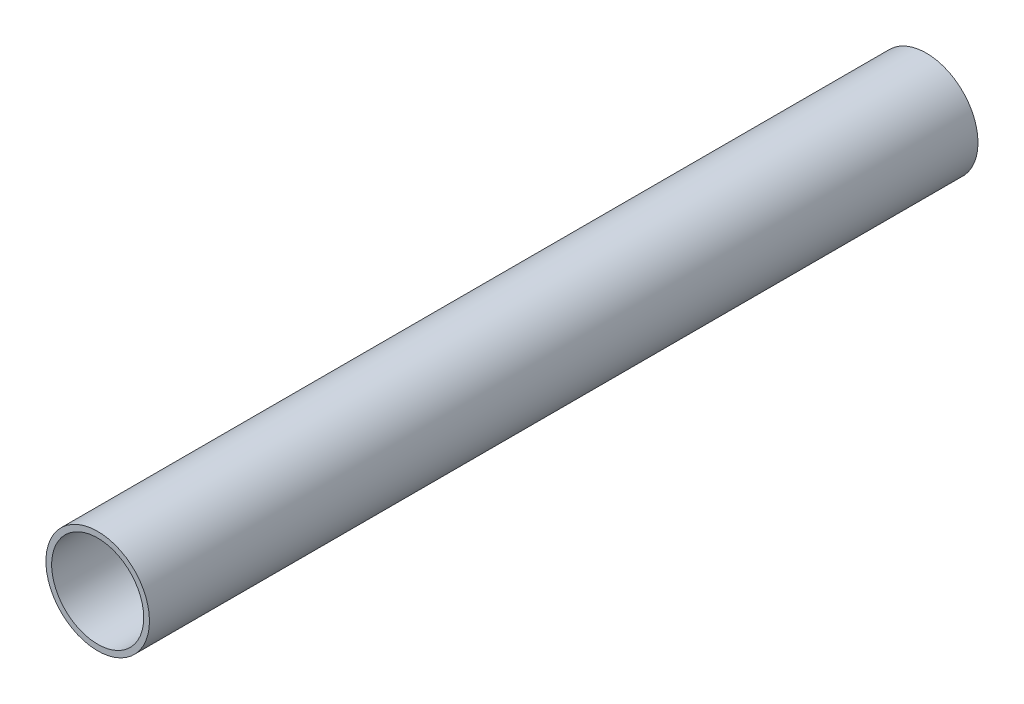
ISO-10303-21;
HEADER;
FILE_DESCRIPTION(('STEP AP214'),'2;1');
FILE_NAME('part.step','',(''),(''),'','','');
FILE_SCHEMA(('AUTOMOTIVE_DESIGN { 1 0 10303 214 1 1 1 1 }'));
ENDSEC;
DATA;
#1=APPLICATION_CONTEXT('core data for automotive mechanical design processes');
#2=APPLICATION_PROTOCOL_DEFINITION('international standard','automotive_design',2000,#1);
#3=PRODUCT_CONTEXT('',#1,'mechanical');
#4=PRODUCT('Part','Part','',(#3));
#5=PRODUCT_RELATED_PRODUCT_CATEGORY('part','',(#4));
#6=PRODUCT_DEFINITION_FORMATION('','',#4);
#7=PRODUCT_DEFINITION_CONTEXT('part definition',#1,'design');
#8=PRODUCT_DEFINITION('design','',#6,#7);
#9=PRODUCT_DEFINITION_SHAPE('','',#8);
#10=(LENGTH_UNIT() NAMED_UNIT(*) SI_UNIT(.MILLI.,.METRE.));
#11=(NAMED_UNIT(*) PLANE_ANGLE_UNIT() SI_UNIT($,.RADIAN.));
#12=(NAMED_UNIT(*) SI_UNIT($,.STERADIAN.) SOLID_ANGLE_UNIT());
#13=UNCERTAINTY_MEASURE_WITH_UNIT(LENGTH_MEASURE(1.E-05),#10,'distance_accuracy_value','');
#14=(GEOMETRIC_REPRESENTATION_CONTEXT(3) GLOBAL_UNCERTAINTY_ASSIGNED_CONTEXT((#13)) GLOBAL_UNIT_ASSIGNED_CONTEXT((#10,
#11,#12)) REPRESENTATION_CONTEXT('',''));
#15=CARTESIAN_POINT('',(0.,0.,0.));
#16=DIRECTION('',(0.,0.,1.));
#17=DIRECTION('',(1.,0.,0.));
#18=AXIS2_PLACEMENT_3D('',#15,#16,#17);
#19=CARTESIAN_POINT('',(0.,0.,228.6));
#20=DIRECTION('',(0.,0.,1.));
#21=DIRECTION('',(1.,0.,0.));
#22=AXIS2_PLACEMENT_3D('',#19,#20,#21);
#23=PLANE('',#22);
#24=CARTESIAN_POINT('',(0.,0.,228.6));
#25=DIRECTION('',(0.,0.,1.));
#26=DIRECTION('',(1.,0.,0.));
#27=AXIS2_PLACEMENT_3D('',#24,#25,#26);
#28=CIRCLE('',#27,14.2875);
#29=CARTESIAN_POINT('',(14.2875,0.,228.6));
#30=VERTEX_POINT('',#29);
#31=EDGE_CURVE('E10',#30,#30,#28,.T.);
#32=ORIENTED_EDGE('',*,*,#31,.T.);
#33=EDGE_LOOP('',(#32));
#34=FACE_BOUND('',#33,.T.);
#35=CARTESIAN_POINT('',(0.,0.,228.6));
#36=DIRECTION('',(0.,0.,1.));
#37=DIRECTION('',(1.,0.,0.));
#38=AXIS2_PLACEMENT_3D('',#35,#36,#37);
#39=CIRCLE('',#38,12.7);
#40=CARTESIAN_POINT('',(12.7,0.,228.6));
#41=VERTEX_POINT('',#40);
#42=EDGE_CURVE('E45',#41,#41,#39,.T.);
#43=ORIENTED_EDGE('',*,*,#42,.F.);
#44=EDGE_LOOP('',(#43));
#45=FACE_BOUND('',#44,.T.);
#46=ADVANCED_FACE('F34',(#34,#45),#23,.T.);
#47=CARTESIAN_POINT('',(0.,0.,0.));
#48=DIRECTION('',(0.,0.,1.));
#49=DIRECTION('',(1.,0.,0.));
#50=AXIS2_PLACEMENT_3D('',#47,#48,#49);
#51=PLANE('',#50);
#52=CARTESIAN_POINT('',(0.,0.,0.));
#53=DIRECTION('',(0.,0.,1.));
#54=DIRECTION('',(1.,0.,0.));
#55=AXIS2_PLACEMENT_3D('',#52,#53,#54);
#56=CIRCLE('',#55,14.2875);
#57=CARTESIAN_POINT('',(14.2875,0.,0.));
#58=VERTEX_POINT('',#57);
#59=EDGE_CURVE('E38',#58,#58,#56,.T.);
#60=ORIENTED_EDGE('',*,*,#59,.F.);
#61=EDGE_LOOP('',(#60));
#62=FACE_BOUND('',#61,.T.);
#63=CARTESIAN_POINT('',(0.,0.,0.));
#64=DIRECTION('',(0.,0.,1.));
#65=DIRECTION('',(1.,0.,0.));
#66=AXIS2_PLACEMENT_3D('',#63,#64,#65);
#67=CIRCLE('',#66,12.7);
#68=CARTESIAN_POINT('',(12.7,0.,0.));
#69=VERTEX_POINT('',#68);
#70=EDGE_CURVE('E47',#69,#69,#67,.T.);
#71=ORIENTED_EDGE('',*,*,#70,.T.);
#72=EDGE_LOOP('',(#71));
#73=FACE_BOUND('',#72,.T.);
#74=ADVANCED_FACE('F57',(#62,#73),#51,.F.);
#75=CARTESIAN_POINT('',(0.,0.,228.6));
#76=DIRECTION('',(0.,0.,-1.));
#77=DIRECTION('',(-1.,0.,0.));
#78=AXIS2_PLACEMENT_3D('',#75,#76,#77);
#79=CYLINDRICAL_SURFACE('',#78,14.2875);
#80=ORIENTED_EDGE('',*,*,#31,.F.);
#81=EDGE_LOOP('',(#80));
#82=FACE_BOUND('',#81,.T.);
#83=ORIENTED_EDGE('',*,*,#59,.T.);
#84=EDGE_LOOP('',(#83));
#85=FACE_BOUND('',#84,.T.);
#86=ADVANCED_FACE('F36',(#82,#85),#79,.T.);
#87=CARTESIAN_POINT('',(0.,0.,228.6));
#88=DIRECTION('',(0.,0.,-1.));
#89=DIRECTION('',(-1.,0.,0.));
#90=AXIS2_PLACEMENT_3D('',#87,#88,#89);
#91=CYLINDRICAL_SURFACE('',#90,12.7);
#92=ORIENTED_EDGE('',*,*,#42,.T.);
#93=EDGE_LOOP('',(#92));
#94=FACE_BOUND('',#93,.T.);
#95=ORIENTED_EDGE('',*,*,#70,.F.);
#96=EDGE_LOOP('',(#95));
#97=FACE_BOUND('',#96,.T.);
#98=ADVANCED_FACE('F53',(#94,#97),#91,.F.);
#99=CLOSED_SHELL('',(#46,#74,#86,#98));
#100=MANIFOLD_SOLID_BREP('B2',#99);
#101=ADVANCED_BREP_SHAPE_REPRESENTATION('',(#18,#100),#14);
#102=SHAPE_DEFINITION_REPRESENTATION(#9,#101);
ENDSEC;
END-ISO-10303-21;
